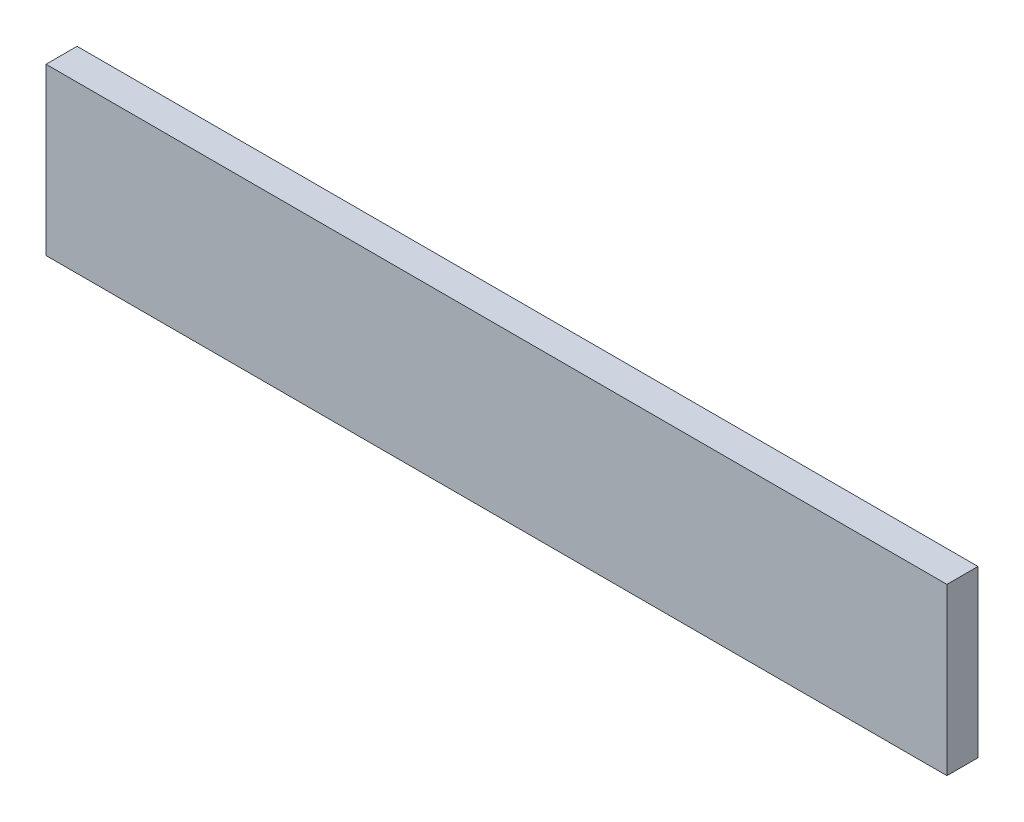
ISO-10303-21;
HEADER;
FILE_DESCRIPTION(('STEP AP214'),'2;1');
FILE_NAME('part.step','',(''),(''),'','','');
FILE_SCHEMA(('AUTOMOTIVE_DESIGN { 1 0 10303 214 1 1 1 1 }'));
ENDSEC;
DATA;
#1=APPLICATION_CONTEXT('core data for automotive mechanical design processes');
#2=APPLICATION_PROTOCOL_DEFINITION('international standard','automotive_design',2000,#1);
#3=PRODUCT_CONTEXT('',#1,'mechanical');
#4=PRODUCT('Part','Part','',(#3));
#5=PRODUCT_RELATED_PRODUCT_CATEGORY('part','',(#4));
#6=PRODUCT_DEFINITION_FORMATION('','',#4);
#7=PRODUCT_DEFINITION_CONTEXT('part definition',#1,'design');
#8=PRODUCT_DEFINITION('design','',#6,#7);
#9=PRODUCT_DEFINITION_SHAPE('','',#8);
#10=(LENGTH_UNIT() NAMED_UNIT(*) SI_UNIT(.MILLI.,.METRE.));
#11=(NAMED_UNIT(*) PLANE_ANGLE_UNIT() SI_UNIT($,.RADIAN.));
#12=(NAMED_UNIT(*) SI_UNIT($,.STERADIAN.) SOLID_ANGLE_UNIT());
#13=UNCERTAINTY_MEASURE_WITH_UNIT(LENGTH_MEASURE(1.E-05),#10,'distance_accuracy_value','');
#14=(GEOMETRIC_REPRESENTATION_CONTEXT(3) GLOBAL_UNCERTAINTY_ASSIGNED_CONTEXT((#13)) GLOBAL_UNIT_ASSIGNED_CONTEXT((#10,
#11,#12)) REPRESENTATION_CONTEXT('',''));
#15=CARTESIAN_POINT('',(0.,0.,0.));
#16=DIRECTION('',(0.,0.,1.));
#17=DIRECTION('',(1.,0.,0.));
#18=AXIS2_PLACEMENT_3D('',#15,#16,#17);
#19=CARTESIAN_POINT('',(276.225,-50.8,-19.05));
#20=DIRECTION('',(1.,0.,0.));
#21=DIRECTION('',(0.,0.,-1.));
#22=AXIS2_PLACEMENT_3D('',#19,#20,#21);
#23=PLANE('',#22);
#24=DIRECTION('',(0.,1.,0.));
#25=VECTOR('',#24,1.);
#26=CARTESIAN_POINT('',(276.225,-50.8,0.));
#27=LINE('',#26,#25);
#28=CARTESIAN_POINT('',(276.225,-50.8,0.));
#29=VERTEX_POINT('',#28);
#30=CARTESIAN_POINT('',(276.225,50.8,0.));
#31=VERTEX_POINT('',#30);
#32=EDGE_CURVE('E108',#29,#31,#27,.T.);
#33=ORIENTED_EDGE('',*,*,#32,.F.);
#34=DIRECTION('',(0.,0.,1.));
#35=VECTOR('',#34,1.);
#36=CARTESIAN_POINT('',(276.225,-50.8,-19.05));
#37=LINE('',#36,#35);
#38=CARTESIAN_POINT('',(276.225,-50.8,-19.05));
#39=VERTEX_POINT('',#38);
#40=EDGE_CURVE('E11',#39,#29,#37,.T.);
#41=ORIENTED_EDGE('',*,*,#40,.F.);
#42=DIRECTION('',(0.,1.,0.));
#43=VECTOR('',#42,1.);
#44=CARTESIAN_POINT('',(276.225,-50.8,-19.05));
#45=LINE('',#44,#43);
#46=CARTESIAN_POINT('',(276.225,50.8,-19.05));
#47=VERTEX_POINT('',#46);
#48=EDGE_CURVE('E100',#39,#47,#45,.T.);
#49=ORIENTED_EDGE('',*,*,#48,.T.);
#50=DIRECTION('',(0.,0.,1.));
#51=VECTOR('',#50,1.);
#52=CARTESIAN_POINT('',(276.225,50.8,-19.05));
#53=LINE('',#52,#51);
#54=EDGE_CURVE('E41',#47,#31,#53,.T.);
#55=ORIENTED_EDGE('',*,*,#54,.T.);
#56=EDGE_LOOP('',(#33,#41,#49,#55));
#57=FACE_BOUND('',#56,.T.);
#58=ADVANCED_FACE('F38',(#57),#23,.T.);
#59=CARTESIAN_POINT('',(-276.225,-50.8,-19.05));
#60=DIRECTION('',(0.,-1.,0.));
#61=DIRECTION('',(0.,0.,-1.));
#62=AXIS2_PLACEMENT_3D('',#59,#60,#61);
#63=PLANE('',#62);
#64=DIRECTION('',(1.,0.,0.));
#65=VECTOR('',#64,1.);
#66=CARTESIAN_POINT('',(-276.225,-50.8,0.));
#67=LINE('',#66,#65);
#68=CARTESIAN_POINT('',(-276.225,-50.8,0.));
#69=VERTEX_POINT('',#68);
#70=EDGE_CURVE('E103',#69,#29,#67,.T.);
#71=ORIENTED_EDGE('',*,*,#70,.F.);
#72=DIRECTION('',(0.,0.,1.));
#73=VECTOR('',#72,1.);
#74=CARTESIAN_POINT('',(-276.225,-50.8,-19.05));
#75=LINE('',#74,#73);
#76=CARTESIAN_POINT('',(-276.225,-50.8,-19.05));
#77=VERTEX_POINT('',#76);
#78=EDGE_CURVE('E48',#77,#69,#75,.T.);
#79=ORIENTED_EDGE('',*,*,#78,.F.);
#80=DIRECTION('',(1.,0.,0.));
#81=VECTOR('',#80,1.);
#82=CARTESIAN_POINT('',(-276.225,-50.8,-19.05));
#83=LINE('',#82,#81);
#84=EDGE_CURVE('E95',#77,#39,#83,.T.);
#85=ORIENTED_EDGE('',*,*,#84,.T.);
#86=ORIENTED_EDGE('',*,*,#40,.T.);
#87=EDGE_LOOP('',(#71,#79,#85,#86));
#88=FACE_BOUND('',#87,.T.);
#89=ADVANCED_FACE('F124',(#88),#63,.T.);
#90=CARTESIAN_POINT('',(-276.225,-50.8,-19.05));
#91=DIRECTION('',(-1.,0.,0.));
#92=DIRECTION('',(0.,0.,1.));
#93=AXIS2_PLACEMENT_3D('',#90,#91,#92);
#94=PLANE('',#93);
#95=DIRECTION('',(0.,-1.,0.));
#96=VECTOR('',#95,1.);
#97=CARTESIAN_POINT('',(-276.225,-50.8,0.));
#98=LINE('',#97,#96);
#99=CARTESIAN_POINT('',(-276.225,50.8,0.));
#100=VERTEX_POINT('',#99);
#101=EDGE_CURVE('E89',#100,#69,#98,.T.);
#102=ORIENTED_EDGE('',*,*,#101,.F.);
#103=DIRECTION('',(0.,0.,1.));
#104=VECTOR('',#103,1.);
#105=CARTESIAN_POINT('',(-276.225,50.8,-19.05));
#106=LINE('',#105,#104);
#107=CARTESIAN_POINT('',(-276.225,50.8,-19.05));
#108=VERTEX_POINT('',#107);
#109=EDGE_CURVE('E84',#108,#100,#106,.T.);
#110=ORIENTED_EDGE('',*,*,#109,.F.);
#111=DIRECTION('',(0.,-1.,0.));
#112=VECTOR('',#111,1.);
#113=CARTESIAN_POINT('',(-276.225,-50.8,-19.05));
#114=LINE('',#113,#112);
#115=EDGE_CURVE('E87',#108,#77,#114,.T.);
#116=ORIENTED_EDGE('',*,*,#115,.T.);
#117=ORIENTED_EDGE('',*,*,#78,.T.);
#118=EDGE_LOOP('',(#102,#110,#116,#117));
#119=FACE_BOUND('',#118,.T.);
#120=ADVANCED_FACE('F86',(#119),#94,.T.);
#121=CARTESIAN_POINT('',(-276.225,50.8,-19.05));
#122=DIRECTION('',(0.,1.,0.));
#123=DIRECTION('',(0.,0.,1.));
#124=AXIS2_PLACEMENT_3D('',#121,#122,#123);
#125=PLANE('',#124);
#126=DIRECTION('',(-1.,0.,0.));
#127=VECTOR('',#126,1.);
#128=CARTESIAN_POINT('',(-276.225,50.8,0.));
#129=LINE('',#128,#127);
#130=EDGE_CURVE('E112',#31,#100,#129,.T.);
#131=ORIENTED_EDGE('',*,*,#130,.F.);
#132=ORIENTED_EDGE('',*,*,#54,.F.);
#133=DIRECTION('',(-1.,0.,0.));
#134=VECTOR('',#133,1.);
#135=CARTESIAN_POINT('',(-276.225,50.8,-19.05));
#136=LINE('',#135,#134);
#137=EDGE_CURVE('E94',#47,#108,#136,.T.);
#138=ORIENTED_EDGE('',*,*,#137,.T.);
#139=ORIENTED_EDGE('',*,*,#109,.T.);
#140=EDGE_LOOP('',(#131,#132,#138,#139));
#141=FACE_BOUND('',#140,.T.);
#142=ADVANCED_FACE('F98',(#141),#125,.T.);
#143=CARTESIAN_POINT('',(0.,0.,-19.05));
#144=DIRECTION('',(0.,0.,-1.));
#145=DIRECTION('',(-1.,0.,0.));
#146=AXIS2_PLACEMENT_3D('',#143,#144,#145);
#147=PLANE('',#146);
#148=ORIENTED_EDGE('',*,*,#48,.F.);
#149=ORIENTED_EDGE('',*,*,#84,.F.);
#150=ORIENTED_EDGE('',*,*,#115,.F.);
#151=ORIENTED_EDGE('',*,*,#137,.F.);
#152=EDGE_LOOP('',(#148,#149,#150,#151));
#153=FACE_BOUND('',#152,.T.);
#154=ADVANCED_FACE('F93',(#153),#147,.T.);
#155=CARTESIAN_POINT('',(0.,0.,0.));
#156=DIRECTION('',(0.,0.,-1.));
#157=DIRECTION('',(-1.,0.,0.));
#158=AXIS2_PLACEMENT_3D('',#155,#156,#157);
#159=PLANE('',#158);
#160=ORIENTED_EDGE('',*,*,#32,.T.);
#161=ORIENTED_EDGE('',*,*,#130,.T.);
#162=ORIENTED_EDGE('',*,*,#101,.T.);
#163=ORIENTED_EDGE('',*,*,#70,.T.);
#164=EDGE_LOOP('',(#160,#161,#162,#163));
#165=FACE_BOUND('',#164,.T.);
#166=ADVANCED_FACE('F123',(#165),#159,.F.);
#167=CLOSED_SHELL('',(#58,#89,#120,#142,#154,#166));
#168=MANIFOLD_SOLID_BREP('B2',#167);
#169=ADVANCED_BREP_SHAPE_REPRESENTATION('',(#18,#168),#14);
#170=SHAPE_DEFINITION_REPRESENTATION(#9,#169);
ENDSEC;
END-ISO-10303-21;
